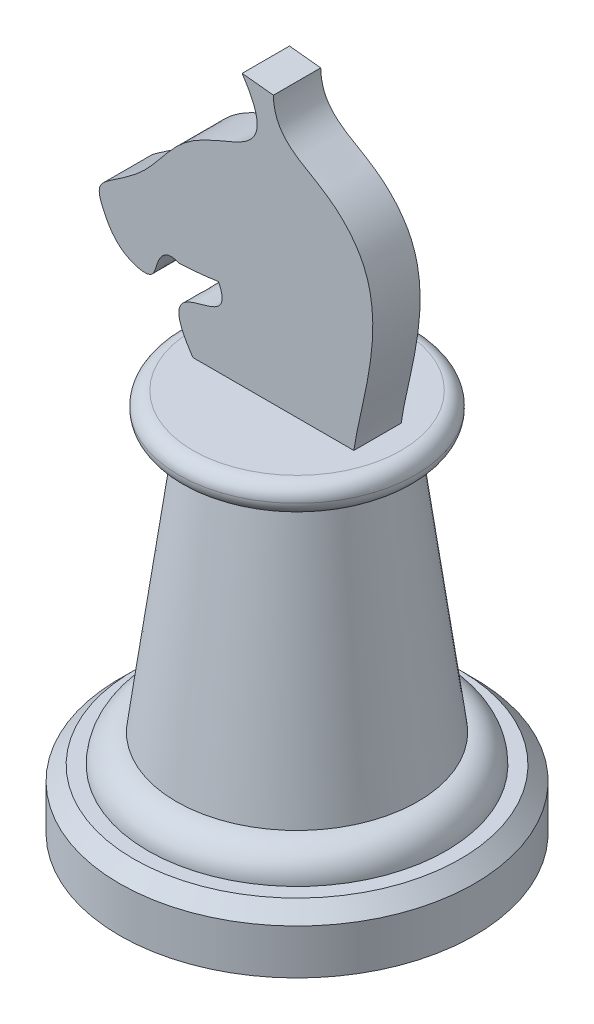
ISO-10303-21;
HEADER;
FILE_DESCRIPTION(('STEP AP214'),'2;1');
FILE_NAME('part.step','',(''),(''),'','','');
FILE_SCHEMA(('AUTOMOTIVE_DESIGN { 1 0 10303 214 1 1 1 1 }'));
ENDSEC;
DATA;
#1=APPLICATION_CONTEXT('core data for automotive mechanical design processes');
#2=APPLICATION_PROTOCOL_DEFINITION('international standard','automotive_design',2000,#1);
#3=PRODUCT_CONTEXT('',#1,'mechanical');
#4=PRODUCT('Part','Part','',(#3));
#5=PRODUCT_RELATED_PRODUCT_CATEGORY('part','',(#4));
#6=PRODUCT_DEFINITION_FORMATION('','',#4);
#7=PRODUCT_DEFINITION_CONTEXT('part definition',#1,'design');
#8=PRODUCT_DEFINITION('design','',#6,#7);
#9=PRODUCT_DEFINITION_SHAPE('','',#8);
#10=(LENGTH_UNIT() NAMED_UNIT(*) SI_UNIT(.MILLI.,.METRE.));
#11=(NAMED_UNIT(*) PLANE_ANGLE_UNIT() SI_UNIT($,.RADIAN.));
#12=(NAMED_UNIT(*) SI_UNIT($,.STERADIAN.) SOLID_ANGLE_UNIT());
#13=UNCERTAINTY_MEASURE_WITH_UNIT(LENGTH_MEASURE(1.E-05),#10,'distance_accuracy_value','');
#14=(GEOMETRIC_REPRESENTATION_CONTEXT(3) GLOBAL_UNCERTAINTY_ASSIGNED_CONTEXT((#13)) GLOBAL_UNIT_ASSIGNED_CONTEXT((#10,
#11,#12)) REPRESENTATION_CONTEXT('',''));
#15=CARTESIAN_POINT('',(0.,0.,0.));
#16=DIRECTION('',(0.,0.,1.));
#17=DIRECTION('',(1.,0.,0.));
#18=AXIS2_PLACEMENT_3D('',#15,#16,#17);
#19=CARTESIAN_POINT('',(-2.9464,24.7904,1.27));
#20=CARTESIAN_POINT('',(-1.69514894814274,22.2600368477273,1.27));
#21=CARTESIAN_POINT('',(-6.97067471922857,24.4491348515803,1.27));
#22=CARTESIAN_POINT('',(-4.318,20.574,1.27));
#23=B_SPLINE_CURVE_WITH_KNOTS('',3,(#19,#20,#21,#22),.UNSPECIFIED.,.F.,.F.,(4,4),(0.,1.),.UNSPECIFIED.);
#24=DIRECTION('',(0.,0.,-1.));
#25=VECTOR('',#24,1.);
#26=SURFACE_OF_LINEAR_EXTRUSION('',#23,#25);
#27=CARTESIAN_POINT('',(-2.9464,24.7904,-1.27));
#28=CARTESIAN_POINT('',(-1.69514894814274,22.2600368477273,-1.27));
#29=CARTESIAN_POINT('',(-6.97067471922857,24.4491348515803,-1.27));
#30=CARTESIAN_POINT('',(-4.318,20.574,-1.27));
#31=B_SPLINE_CURVE_WITH_KNOTS('',3,(#27,#28,#29,#30),.UNSPECIFIED.,.F.,.F.,(4,4),(0.,1.),.UNSPECIFIED.);
#32=CARTESIAN_POINT('',(-2.9464,24.7904,-1.27));
#33=VERTEX_POINT('',#32);
#34=CARTESIAN_POINT('',(-4.318,20.574,-1.27));
#35=VERTEX_POINT('',#34);
#36=EDGE_CURVE('E212',#33,#35,#31,.T.);
#37=ORIENTED_EDGE('',*,*,#36,.T.);
#38=DIRECTION('',(0.,0.,-1.));
#39=VECTOR('',#38,1.);
#40=CARTESIAN_POINT('',(-4.318,20.574,1.27));
#41=LINE('',#40,#39);
#42=CARTESIAN_POINT('',(-4.318,20.574,1.27));
#43=VERTEX_POINT('',#42);
#44=EDGE_CURVE('E12',#43,#35,#41,.T.);
#45=ORIENTED_EDGE('',*,*,#44,.F.);
#46=CARTESIAN_POINT('',(-2.9464,24.7904,1.27));
#47=VERTEX_POINT('',#46);
#48=EDGE_CURVE('E164',#47,#43,#23,.T.);
#49=ORIENTED_EDGE('',*,*,#48,.F.);
#50=DIRECTION('',(0.,0.,-1.));
#51=VECTOR('',#50,1.);
#52=CARTESIAN_POINT('',(-2.9464,24.7904,1.27));
#53=LINE('',#52,#51);
#54=EDGE_CURVE('E98',#47,#33,#53,.T.);
#55=ORIENTED_EDGE('',*,*,#54,.T.);
#56=EDGE_LOOP('',(#37,#45,#49,#55));
#57=FACE_BOUND('',#56,.T.);
#58=ADVANCED_FACE('F50',(#57),#26,.F.);
#59=CARTESIAN_POINT('',(-4.318,20.574,1.27));
#60=DIRECTION('',(0.,1.,0.));
#61=DIRECTION('',(0.,0.,1.));
#62=AXIS2_PLACEMENT_3D('',#59,#60,#61);
#63=PLANE('',#62);
#64=DIRECTION('',(1.,0.,0.));
#65=VECTOR('',#64,1.);
#66=CARTESIAN_POINT('',(-4.318,20.574,-1.27));
#67=LINE('',#66,#65);
#68=CARTESIAN_POINT('',(4.318,20.574,-1.27));
#69=VERTEX_POINT('',#68);
#70=EDGE_CURVE('E198',#35,#69,#67,.T.);
#71=ORIENTED_EDGE('',*,*,#70,.T.);
#72=DIRECTION('',(0.,0.,-1.));
#73=VECTOR('',#72,1.);
#74=CARTESIAN_POINT('',(4.318,20.574,1.27));
#75=LINE('',#74,#73);
#76=CARTESIAN_POINT('',(4.318,20.574,1.27));
#77=VERTEX_POINT('',#76);
#78=EDGE_CURVE('E61',#77,#69,#75,.T.);
#79=ORIENTED_EDGE('',*,*,#78,.F.);
#80=DIRECTION('',(1.,0.,0.));
#81=VECTOR('',#80,1.);
#82=CARTESIAN_POINT('',(-4.318,20.574,1.27));
#83=LINE('',#82,#81);
#84=EDGE_CURVE('E105',#43,#77,#83,.T.);
#85=ORIENTED_EDGE('',*,*,#84,.F.);
#86=ORIENTED_EDGE('',*,*,#44,.T.);
#87=EDGE_LOOP('',(#71,#79,#85,#86));
#88=FACE_BOUND('',#87,.T.);
#89=ADVANCED_FACE('F155',(#88),#63,.F.);
#90=CARTESIAN_POINT('',(4.318,20.574,1.27));
#91=CARTESIAN_POINT('',(4.64545305658822,22.9544229753302,1.27));
#92=CARTESIAN_POINT('',(6.57533069921548,28.0561594288544,1.27));
#93=CARTESIAN_POINT('',(2.59986954258202,32.2989383424736,1.27));
#94=CARTESIAN_POINT('',(0.0377823707133336,33.0033363877919,1.27));
#95=CARTESIAN_POINT('',(0.,34.925,1.27));
#96=B_SPLINE_CURVE_WITH_KNOTS('',3,(#90,#91,#92,#93,#94,#95),.UNSPECIFIED.,.F.,.F.,(4,1,1,4),
(0.,0.547549593464603,0.73319457296583,1.),.UNSPECIFIED.);
#97=DIRECTION('',(0.,0.,-1.));
#98=VECTOR('',#97,1.);
#99=SURFACE_OF_LINEAR_EXTRUSION('',#96,#98);
#100=CARTESIAN_POINT('',(4.318,20.574,-1.27));
#101=CARTESIAN_POINT('',(4.64545305658822,22.9544229753302,-1.27));
#102=CARTESIAN_POINT('',(6.57533069921548,28.0561594288544,-1.27));
#103=CARTESIAN_POINT('',(2.59986954258202,32.2989383424736,-1.27));
#104=CARTESIAN_POINT('',(0.0377823707133336,33.0033363877919,-1.27));
#105=CARTESIAN_POINT('',(0.,34.925,-1.27));
#106=B_SPLINE_CURVE_WITH_KNOTS('',3,(#100,#101,#102,#103,#104,#105),.UNSPECIFIED.,.F.,.F.,(4,1,
1,4),(0.,0.547549593464603,0.73319457296583,1.),.UNSPECIFIED.);
#107=CARTESIAN_POINT('',(0.,34.925,-1.27));
#108=VERTEX_POINT('',#107);
#109=EDGE_CURVE('E194',#69,#108,#106,.T.);
#110=ORIENTED_EDGE('',*,*,#109,.T.);
#111=DIRECTION('',(0.,0.,-1.));
#112=VECTOR('',#111,1.);
#113=CARTESIAN_POINT('',(0.,34.925,1.27));
#114=LINE('',#113,#112);
#115=CARTESIAN_POINT('',(0.,34.925,1.27));
#116=VERTEX_POINT('',#115);
#117=EDGE_CURVE('E128',#116,#108,#114,.T.);
#118=ORIENTED_EDGE('',*,*,#117,.F.);
#119=EDGE_CURVE('E118',#77,#116,#96,.T.);
#120=ORIENTED_EDGE('',*,*,#119,.F.);
#121=ORIENTED_EDGE('',*,*,#78,.T.);
#122=EDGE_LOOP('',(#110,#118,#120,#121));
#123=FACE_BOUND('',#122,.T.);
#124=ADVANCED_FACE('F153',(#123),#99,.F.);
#125=CARTESIAN_POINT('',(0.,34.925,1.27));
#126=DIRECTION('',(-0.105469062013453,-0.994422584698277,0.));
#127=DIRECTION('',(0.994422584698277,-0.105469062013453,0.));
#128=AXIS2_PLACEMENT_3D('',#125,#126,#127);
#129=PLANE('',#128);
#130=CARTESIAN_POINT('',(0.,34.925,-1.27));
#131=CARTESIAN_POINT('',(-1.6764,35.1028,-1.27));
#132=B_SPLINE_CURVE_WITH_KNOTS('',1,(#130,#131),.UNSPECIFIED.,.F.,.F.,(2,2),(0.,1.),.UNSPECIFIED.);
#133=CARTESIAN_POINT('',(-1.6764,35.1028,-1.27));
#134=VERTEX_POINT('',#133);
#135=EDGE_CURVE('E125',#108,#134,#132,.T.);
#136=ORIENTED_EDGE('',*,*,#135,.T.);
#137=DIRECTION('',(0.,0.,-1.));
#138=VECTOR('',#137,1.);
#139=CARTESIAN_POINT('',(-1.6764,35.1028,1.27));
#140=LINE('',#139,#138);
#141=CARTESIAN_POINT('',(-1.6764,35.1028,1.27));
#142=VERTEX_POINT('',#141);
#143=EDGE_CURVE('E54',#142,#134,#140,.T.);
#144=ORIENTED_EDGE('',*,*,#143,.F.);
#145=CARTESIAN_POINT('',(0.,34.925,1.27));
#146=CARTESIAN_POINT('',(-1.6764,35.1028,1.27));
#147=B_SPLINE_CURVE_WITH_KNOTS('',1,(#145,#146),.UNSPECIFIED.,.F.,.F.,(2,2),(0.,1.),.UNSPECIFIED.);
#148=EDGE_CURVE('E112',#116,#142,#147,.T.);
#149=ORIENTED_EDGE('',*,*,#148,.F.);
#150=ORIENTED_EDGE('',*,*,#117,.T.);
#151=EDGE_LOOP('',(#136,#144,#149,#150));
#152=FACE_BOUND('',#151,.T.);
#153=ADVANCED_FACE('F123',(#152),#129,.F.);
#154=CARTESIAN_POINT('',(-1.6764,35.1028,1.27));
#155=CARTESIAN_POINT('',(0.0395445647804974,32.5446844188125,1.27));
#156=CARTESIAN_POINT('',(-2.11328260049261,31.7187499286617,1.27));
#157=CARTESIAN_POINT('',(-5.1513588940975,30.3849431494915,1.27));
#158=CARTESIAN_POINT('',(-6.60049084506346,28.03625292549,1.27));
#159=CARTESIAN_POINT('',(-8.24445154449945,26.9332910488863,1.27));
#160=CARTESIAN_POINT('',(-9.52927085956396,26.0696615188838,1.27));
#161=CARTESIAN_POINT('',(-8.96115386260296,24.553135099532,1.27));
#162=CARTESIAN_POINT('',(-8.19036388830336,23.4116657598685,1.27));
#163=CARTESIAN_POINT('',(-6.40754864529845,23.0930054064793,1.27));
#164=CARTESIAN_POINT('',(-6.22621108359615,24.3441716716608,1.27));
#165=CARTESIAN_POINT('',(-5.66663912746974,24.8602494386718,1.27));
#166=CARTESIAN_POINT('',(-5.08,24.5872,1.27));
#167=B_SPLINE_CURVE_WITH_KNOTS('',3,(#154,#155,#156,#157,#158,#159,#160,#161,#162,#163,#164,
#165,#166),.UNSPECIFIED.,.F.,.F.,(4,1,1,1,1,1,1,1,1,1,4),(0.,0.216928245775554,
0.343595523063613,0.50686823557719,0.617222943855262,0.667266309633084,0.71404547441683,
0.835535369035167,0.88797545747018,0.92962674552069,1.),.UNSPECIFIED.);
#168=DIRECTION('',(0.,0.,-1.));
#169=VECTOR('',#168,1.);
#170=SURFACE_OF_LINEAR_EXTRUSION('',#167,#169);
#171=CARTESIAN_POINT('',(-1.6764,35.1028,-1.27));
#172=CARTESIAN_POINT('',(0.0395445647804974,32.5446844188125,-1.27));
#173=CARTESIAN_POINT('',(-2.11328260049261,31.7187499286617,-1.27));
#174=CARTESIAN_POINT('',(-5.1513588940975,30.3849431494915,-1.27));
#175=CARTESIAN_POINT('',(-6.60049084506346,28.03625292549,-1.27));
#176=CARTESIAN_POINT('',(-8.24445154449945,26.9332910488863,-1.27));
#177=CARTESIAN_POINT('',(-9.52927085956396,26.0696615188838,-1.27));
#178=CARTESIAN_POINT('',(-8.96115386260296,24.553135099532,-1.27));
#179=CARTESIAN_POINT('',(-8.19036388830336,23.4116657598685,-1.27));
#180=CARTESIAN_POINT('',(-6.40754864529845,23.0930054064793,-1.27));
#181=CARTESIAN_POINT('',(-6.22621108359615,24.3441716716608,-1.27));
#182=CARTESIAN_POINT('',(-5.66663912746974,24.8602494386718,-1.27));
#183=CARTESIAN_POINT('',(-5.08,24.5872,-1.27));
#184=B_SPLINE_CURVE_WITH_KNOTS('',3,(#171,#172,#173,#174,#175,#176,#177,#178,#179,#180,#181,
#182,#183),.UNSPECIFIED.,.F.,.F.,(4,1,1,1,1,1,1,1,1,1,4),(0.,0.216928245775554,
0.343595523063613,0.50686823557719,0.617222943855262,0.667266309633084,0.71404547441683,
0.835535369035167,0.88797545747018,0.92962674552069,1.),.UNSPECIFIED.);
#185=CARTESIAN_POINT('',(-5.08,24.5872,-1.27));
#186=VERTEX_POINT('',#185);
#187=EDGE_CURVE('E173',#134,#186,#184,.T.);
#188=ORIENTED_EDGE('',*,*,#187,.T.);
#189=DIRECTION('',(0.,0.,-1.));
#190=VECTOR('',#189,1.);
#191=CARTESIAN_POINT('',(-5.08,24.5872,1.27));
#192=LINE('',#191,#190);
#193=CARTESIAN_POINT('',(-5.08,24.5872,1.27));
#194=VERTEX_POINT('',#193);
#195=EDGE_CURVE('E91',#194,#186,#192,.T.);
#196=ORIENTED_EDGE('',*,*,#195,.F.);
#197=EDGE_CURVE('E116',#142,#194,#167,.T.);
#198=ORIENTED_EDGE('',*,*,#197,.F.);
#199=ORIENTED_EDGE('',*,*,#143,.T.);
#200=EDGE_LOOP('',(#188,#196,#198,#199));
#201=FACE_BOUND('',#200,.T.);
#202=ADVANCED_FACE('F129',(#201),#170,.F.);
#203=CARTESIAN_POINT('',(-5.08,24.5872,1.27));
#204=CARTESIAN_POINT('',(-4.00740469107445,24.6287535314744,1.27));
#205=CARTESIAN_POINT('',(-2.9464,24.7904,1.27));
#206=B_SPLINE_CURVE_WITH_KNOTS('',2,(#203,#204,#205),.UNSPECIFIED.,.F.,.F.,(3,3),(0.,1.),.UNSPECIFIED.);
#207=DIRECTION('',(0.,0.,-1.));
#208=VECTOR('',#207,1.);
#209=SURFACE_OF_LINEAR_EXTRUSION('',#206,#208);
#210=CARTESIAN_POINT('',(-5.08,24.5872,-1.27));
#211=CARTESIAN_POINT('',(-4.00740469107445,24.6287535314744,-1.27));
#212=CARTESIAN_POINT('',(-2.9464,24.7904,-1.27));
#213=B_SPLINE_CURVE_WITH_KNOTS('',2,(#210,#211,#212),.UNSPECIFIED.,.F.,.F.,(3,3),(0.,1.),.UNSPECIFIED.);
#214=EDGE_CURVE('E168',#186,#33,#213,.T.);
#215=ORIENTED_EDGE('',*,*,#214,.T.);
#216=ORIENTED_EDGE('',*,*,#54,.F.);
#217=EDGE_CURVE('E70',#194,#47,#206,.T.);
#218=ORIENTED_EDGE('',*,*,#217,.F.);
#219=ORIENTED_EDGE('',*,*,#195,.T.);
#220=EDGE_LOOP('',(#215,#216,#218,#219));
#221=FACE_BOUND('',#220,.T.);
#222=ADVANCED_FACE('F149',(#221),#209,.F.);
#223=CARTESIAN_POINT('',(-4.15773387526424,23.1864893872403,1.27));
#224=DIRECTION('',(0.,0.,1.));
#225=DIRECTION('',(1.,0.,0.));
#226=AXIS2_PLACEMENT_3D('',#223,#224,#225);
#227=PLANE('',#226);
#228=ORIENTED_EDGE('',*,*,#48,.T.);
#229=ORIENTED_EDGE('',*,*,#84,.T.);
#230=ORIENTED_EDGE('',*,*,#119,.T.);
#231=ORIENTED_EDGE('',*,*,#148,.T.);
#232=ORIENTED_EDGE('',*,*,#197,.T.);
#233=ORIENTED_EDGE('',*,*,#217,.T.);
#234=EDGE_LOOP('',(#228,#229,#230,#231,#232,#233));
#235=FACE_BOUND('',#234,.T.);
#236=ADVANCED_FACE('F114',(#235),#227,.T.);
#237=CARTESIAN_POINT('',(-4.15773387526424,23.1864893872403,-1.27));
#238=DIRECTION('',(0.,0.,1.));
#239=DIRECTION('',(1.,0.,0.));
#240=AXIS2_PLACEMENT_3D('',#237,#238,#239);
#241=PLANE('',#240);
#242=ORIENTED_EDGE('',*,*,#36,.F.);
#243=ORIENTED_EDGE('',*,*,#214,.F.);
#244=ORIENTED_EDGE('',*,*,#187,.F.);
#245=ORIENTED_EDGE('',*,*,#135,.F.);
#246=ORIENTED_EDGE('',*,*,#109,.F.);
#247=ORIENTED_EDGE('',*,*,#70,.F.);
#248=EDGE_LOOP('',(#242,#243,#244,#245,#246,#247));
#249=FACE_BOUND('',#248,.T.);
#250=ADVANCED_FACE('F200',(#249),#241,.F.);
#251=CLOSED_SHELL('',(#58,#89,#124,#153,#202,#222,#236,#250));
#252=MANIFOLD_SOLID_BREP('B2',#251);
#253=CARTESIAN_POINT('',(0.,0.,0.));
#254=DIRECTION('',(0.,-1.,0.));
#255=DIRECTION('',(0.,0.,-1.));
#256=AXIS2_PLACEMENT_3D('',#253,#254,#255);
#257=PLANE('',#256);
#258=CARTESIAN_POINT('',(0.,0.,0.));
#259=DIRECTION('',(0.,1.,0.));
#260=DIRECTION('',(0.,0.,1.));
#261=AXIS2_PLACEMENT_3D('',#258,#259,#260);
#262=CIRCLE('',#261,9.525);
#263=CARTESIAN_POINT('',(0.,0.,9.525));
#264=VERTEX_POINT('',#263);
#265=EDGE_CURVE('E303',#264,#264,#262,.T.);
#266=ORIENTED_EDGE('',*,*,#265,.F.);
#267=EDGE_LOOP('',(#266));
#268=FACE_BOUND('',#267,.T.);
#269=ADVANCED_FACE('F283',(#268),#257,.T.);
#270=CARTESIAN_POINT('',(0.,20.574,0.));
#271=DIRECTION('',(0.,1.,0.));
#272=DIRECTION('',(0.,0.,1.));
#273=AXIS2_PLACEMENT_3D('',#270,#271,#272);
#274=CYLINDRICAL_SURFACE('',#273,9.525);
#275=CARTESIAN_POINT('',(0.,2.413,0.));
#276=DIRECTION('',(0.,1.,0.));
#277=DIRECTION('',(0.,0.,1.));
#278=AXIS2_PLACEMENT_3D('',#275,#276,#277);
#279=CIRCLE('',#278,9.525);
#280=CARTESIAN_POINT('',(0.,2.413,9.525));
#281=VERTEX_POINT('',#280);
#282=EDGE_CURVE('E295',#281,#281,#279,.F.);
#283=ORIENTED_EDGE('',*,*,#282,.T.);
#284=EDGE_LOOP('',(#283));
#285=FACE_BOUND('',#284,.T.);
#286=ORIENTED_EDGE('',*,*,#265,.T.);
#287=EDGE_LOOP('',(#286));
#288=FACE_BOUND('',#287,.T.);
#289=ADVANCED_FACE('F333',(#285,#288),#274,.T.);
#290=CARTESIAN_POINT('',(-9.525,3.175,0.));
#291=DIRECTION('',(0.,1.,0.));
#292=DIRECTION('',(0.,0.,1.));
#293=AXIS2_PLACEMENT_3D('',#290,#291,#292);
#294=PLANE('',#293);
#295=CARTESIAN_POINT('',(0.,3.175,0.));
#296=DIRECTION('',(0.,1.,0.));
#297=DIRECTION('',(0.,0.,1.));
#298=AXIS2_PLACEMENT_3D('',#295,#296,#297);
#299=CIRCLE('',#298,8.76300000000001);
#300=CARTESIAN_POINT('',(0.,3.175,8.76300000000001));
#301=VERTEX_POINT('',#300);
#302=EDGE_CURVE('E300',#301,#301,#299,.T.);
#303=ORIENTED_EDGE('',*,*,#302,.T.);
#304=EDGE_LOOP('',(#303));
#305=FACE_BOUND('',#304,.T.);
#306=CARTESIAN_POINT('',(0.,3.175,0.));
#307=DIRECTION('',(0.,1.,0.));
#308=DIRECTION('',(0.,0.,1.));
#309=AXIS2_PLACEMENT_3D('',#306,#307,#308);
#310=CIRCLE('',#309,8.001);
#311=CARTESIAN_POINT('',(0.,3.175,8.001));
#312=VERTEX_POINT('',#311);
#313=EDGE_CURVE('E306',#312,#312,#310,.T.);
#314=ORIENTED_EDGE('',*,*,#313,.F.);
#315=EDGE_LOOP('',(#314));
#316=FACE_BOUND('',#315,.T.);
#317=ADVANCED_FACE('F339',(#305,#316),#294,.T.);
#318=CARTESIAN_POINT('',(0.,19.05,0.));
#319=DIRECTION('',(0.,-1.,0.));
#320=DIRECTION('',(0.,0.,-1.));
#321=AXIS2_PLACEMENT_3D('',#318,#319,#320);
#322=CONICAL_SURFACE('',#321,4.572,0.131971822216686);
#323=CARTESIAN_POINT('',(0.,4.699,0.));
#324=DIRECTION('',(0.,1.,0.));
#325=DIRECTION('',(0.,0.,1.));
#326=AXIS2_PLACEMENT_3D('',#323,#324,#325);
#327=CIRCLE('',#326,6.477);
#328=CARTESIAN_POINT('',(0.,4.699,6.477));
#329=VERTEX_POINT('',#328);
#330=EDGE_CURVE('E309',#329,#329,#327,.T.);
#331=ORIENTED_EDGE('',*,*,#330,.T.);
#332=EDGE_LOOP('',(#331));
#333=FACE_BOUND('',#332,.T.);
#334=CARTESIAN_POINT('',(0.,19.05,0.));
#335=DIRECTION('',(0.,1.,0.));
#336=DIRECTION('',(0.,0.,1.));
#337=AXIS2_PLACEMENT_3D('',#334,#335,#336);
#338=CIRCLE('',#337,4.572);
#339=CARTESIAN_POINT('',(0.,19.05,4.572));
#340=VERTEX_POINT('',#339);
#341=EDGE_CURVE('E312',#340,#340,#338,.T.);
#342=ORIENTED_EDGE('',*,*,#341,.F.);
#343=EDGE_LOOP('',(#342));
#344=FACE_BOUND('',#343,.T.);
#345=ADVANCED_FACE('F363',(#333,#344),#322,.T.);
#346=CARTESIAN_POINT('',(-4.572,19.05,0.));
#347=DIRECTION('',(0.,-1.,0.));
#348=DIRECTION('',(0.,0.,-1.));
#349=AXIS2_PLACEMENT_3D('',#346,#347,#348);
#350=PLANE('',#349);
#351=CARTESIAN_POINT('',(0.,19.05,0.));
#352=DIRECTION('',(0.,-1.,0.));
#353=DIRECTION('',(0.,0.,-1.));
#354=AXIS2_PLACEMENT_3D('',#351,#352,#353);
#355=CIRCLE('',#354,5.588);
#356=CARTESIAN_POINT('',(0.,19.05,-5.588));
#357=VERTEX_POINT('',#356);
#358=EDGE_CURVE('E49',#357,#357,#355,.T.);
#359=ORIENTED_EDGE('',*,*,#358,.T.);
#360=EDGE_LOOP('',(#359));
#361=FACE_BOUND('',#360,.T.);
#362=ORIENTED_EDGE('',*,*,#341,.T.);
#363=EDGE_LOOP('',(#362));
#364=FACE_BOUND('',#363,.T.);
#365=ADVANCED_FACE('F354',(#361,#364),#350,.T.);
#366=CARTESIAN_POINT('',(-6.35,20.574,0.));
#367=DIRECTION('',(0.,1.,0.));
#368=DIRECTION('',(0.,0.,1.));
#369=AXIS2_PLACEMENT_3D('',#366,#367,#368);
#370=PLANE('',#369);
#371=CARTESIAN_POINT('',(0.,20.574,0.));
#372=DIRECTION('',(0.,1.,0.));
#373=DIRECTION('',(0.,0.,1.));
#374=AXIS2_PLACEMENT_3D('',#371,#372,#373);
#375=CIRCLE('',#374,5.588);
#376=CARTESIAN_POINT('',(0.,20.574,5.588));
#377=VERTEX_POINT('',#376);
#378=EDGE_CURVE('E291',#377,#377,#375,.T.);
#379=ORIENTED_EDGE('',*,*,#378,.T.);
#380=EDGE_LOOP('',(#379));
#381=FACE_BOUND('',#380,.T.);
#382=ADVANCED_FACE('F349',(#381),#370,.T.);
#383=CARTESIAN_POINT('',(0.,3.175,0.));
#384=DIRECTION('',(0.,-1.,0.));
#385=DIRECTION('',(0.,0.,-1.));
#386=AXIS2_PLACEMENT_3D('',#383,#384,#385);
#387=CONICAL_SURFACE('',#386,8.76300000000001,0.785398163397442);
#388=ORIENTED_EDGE('',*,*,#282,.F.);
#389=EDGE_LOOP('',(#388));
#390=FACE_BOUND('',#389,.T.);
#391=ORIENTED_EDGE('',*,*,#302,.F.);
#392=EDGE_LOOP('',(#391));
#393=FACE_BOUND('',#392,.T.);
#394=ADVANCED_FACE('F329',(#390,#393),#387,.T.);
#395=CARTESIAN_POINT('',(0.,3.175,0.));
#396=DIRECTION('',(0.,1.,0.));
#397=DIRECTION('',(0.,0.,1.));
#398=AXIS2_PLACEMENT_3D('',#395,#396,#397);
#399=TOROIDAL_SURFACE('',#398,6.477,1.524);
#400=ORIENTED_EDGE('',*,*,#313,.T.);
#401=EDGE_LOOP('',(#400));
#402=FACE_BOUND('',#401,.T.);
#403=ORIENTED_EDGE('',*,*,#330,.F.);
#404=EDGE_LOOP('',(#403));
#405=FACE_BOUND('',#404,.T.);
#406=ADVANCED_FACE('F323',(#402,#405),#399,.T.);
#407=CARTESIAN_POINT('',(0.,19.812,0.));
#408=DIRECTION('',(0.,-1.,0.));
#409=DIRECTION('',(0.,0.,-1.));
#410=AXIS2_PLACEMENT_3D('',#407,#408,#409);
#411=TOROIDAL_SURFACE('',#410,5.588,0.762);
#412=ORIENTED_EDGE('',*,*,#358,.F.);
#413=EDGE_LOOP('',(#412));
#414=FACE_BOUND('',#413,.T.);
#415=CARTESIAN_POINT('',(0.,19.812,0.));
#416=DIRECTION('',(0.,-1.,0.));
#417=DIRECTION('',(0.,0.,-1.));
#418=AXIS2_PLACEMENT_3D('',#415,#416,#417);
#419=CIRCLE('',#418,6.35);
#420=CARTESIAN_POINT('',(0.,19.812,-6.35));
#421=VERTEX_POINT('',#420);
#422=EDGE_CURVE('E287',#421,#421,#419,.F.);
#423=ORIENTED_EDGE('',*,*,#422,.F.);
#424=EDGE_LOOP('',(#423));
#425=FACE_BOUND('',#424,.T.);
#426=ADVANCED_FACE('F285',(#414,#425),#411,.T.);
#427=CARTESIAN_POINT('',(0.,19.812,0.));
#428=DIRECTION('',(0.,1.,0.));
#429=DIRECTION('',(0.,0.,1.));
#430=AXIS2_PLACEMENT_3D('',#427,#428,#429);
#431=TOROIDAL_SURFACE('',#430,5.588,0.762);
#432=ORIENTED_EDGE('',*,*,#422,.T.);
#433=EDGE_LOOP('',(#432));
#434=FACE_BOUND('',#433,.T.);
#435=ORIENTED_EDGE('',*,*,#378,.F.);
#436=EDGE_LOOP('',(#435));
#437=FACE_BOUND('',#436,.T.);
#438=ADVANCED_FACE('F319',(#434,#437),#431,.T.);
#439=CLOSED_SHELL('',(#269,#289,#317,#345,#365,#382,#394,#406,#426,#438));
#440=MANIFOLD_SOLID_BREP('B6',#439);
#441=ADVANCED_BREP_SHAPE_REPRESENTATION('',(#18,#252,#440),#14);
#442=SHAPE_DEFINITION_REPRESENTATION(#9,#441);
ENDSEC;
END-ISO-10303-21;
